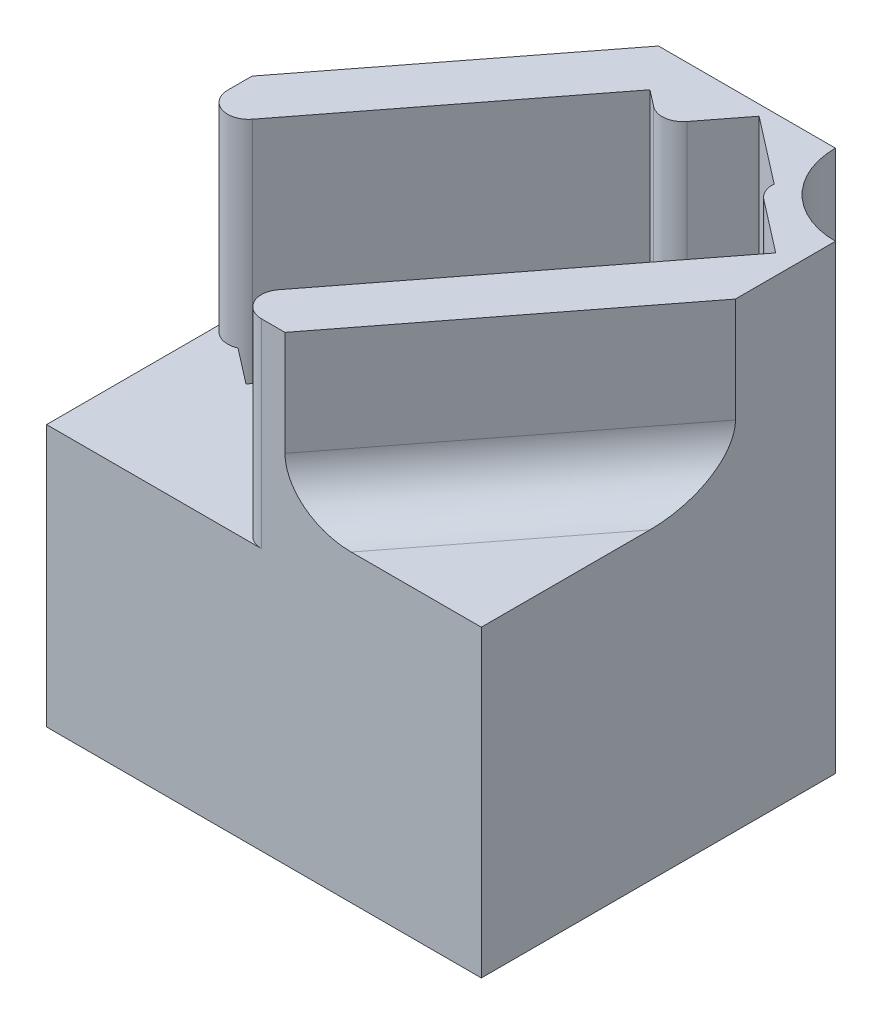
ISO-10303-21;
HEADER;
FILE_DESCRIPTION(('STEP AP214'),'2;1');
FILE_NAME('part.step','',(''),(''),'','','');
FILE_SCHEMA(('AUTOMOTIVE_DESIGN { 1 0 10303 214 1 1 1 1 }'));
ENDSEC;
DATA;
#1=APPLICATION_CONTEXT('core data for automotive mechanical design processes');
#2=APPLICATION_PROTOCOL_DEFINITION('international standard','automotive_design',2000,#1);
#3=PRODUCT_CONTEXT('',#1,'mechanical');
#4=PRODUCT('Part','Part','',(#3));
#5=PRODUCT_RELATED_PRODUCT_CATEGORY('part','',(#4));
#6=PRODUCT_DEFINITION_FORMATION('','',#4);
#7=PRODUCT_DEFINITION_CONTEXT('part definition',#1,'design');
#8=PRODUCT_DEFINITION('design','',#6,#7);
#9=PRODUCT_DEFINITION_SHAPE('','',#8);
#10=(LENGTH_UNIT() NAMED_UNIT(*) SI_UNIT(.MILLI.,.METRE.));
#11=(NAMED_UNIT(*) PLANE_ANGLE_UNIT() SI_UNIT($,.RADIAN.));
#12=(NAMED_UNIT(*) SI_UNIT($,.STERADIAN.) SOLID_ANGLE_UNIT());
#13=UNCERTAINTY_MEASURE_WITH_UNIT(LENGTH_MEASURE(1.E-05),#10,'distance_accuracy_value','');
#14=(GEOMETRIC_REPRESENTATION_CONTEXT(3) GLOBAL_UNCERTAINTY_ASSIGNED_CONTEXT((#13)) GLOBAL_UNIT_ASSIGNED_CONTEXT((#10,
#11,#12)) REPRESENTATION_CONTEXT('',''));
#15=CARTESIAN_POINT('',(0.,0.,0.));
#16=DIRECTION('',(0.,0.,1.));
#17=DIRECTION('',(1.,0.,0.));
#18=AXIS2_PLACEMENT_3D('',#15,#16,#17);
#19=CARTESIAN_POINT('',(6.16520869063758,22.,-12.8703707176091));
#20=DIRECTION('',(-0.61142527879089,0.,0.791302172659398));
#21=DIRECTION('',(0.791302172659398,0.,0.61142527879089));
#22=AXIS2_PLACEMENT_3D('',#19,#20,#21);
#23=PLANE('',#22);
#24=DIRECTION('',(0.791302172659398,0.,0.61142527879089));
#25=VECTOR('',#24,1.);
#26=CARTESIAN_POINT('',(2.99999999999999,25.,-15.3160718327727));
#27=LINE('',#26,#25);
#28=CARTESIAN_POINT('',(2.80883986901435,25.,-15.4637779056485));
#29=VERTEX_POINT('',#28);
#30=CARTESIAN_POINT('',(6.16520869063759,25.,-12.8703707176091));
#31=VERTEX_POINT('',#30);
#32=EDGE_CURVE('E363',#29,#31,#27,.T.);
#33=ORIENTED_EDGE('',*,*,#32,.T.);
#34=DIRECTION('',(0.,1.,0.));
#35=VECTOR('',#34,1.);
#36=CARTESIAN_POINT('',(6.16520869063758,22.,-12.8703707176091));
#37=LINE('',#36,#35);
#38=CARTESIAN_POINT('',(6.16520869063758,22.,-12.8703707176091));
#39=VERTEX_POINT('',#38);
#40=EDGE_CURVE('E403',#39,#31,#37,.T.);
#41=ORIENTED_EDGE('',*,*,#40,.F.);
#42=DIRECTION('',(0.791302172659398,0.,0.61142527879089));
#43=VECTOR('',#42,1.);
#44=CARTESIAN_POINT('',(6.16520869063758,22.,-12.8703707176091));
#45=LINE('',#44,#43);
#46=CARTESIAN_POINT('',(2.80883986901435,22.,-15.4637779056485));
#47=VERTEX_POINT('',#46);
#48=EDGE_CURVE('E386',#47,#39,#45,.T.);
#49=ORIENTED_EDGE('',*,*,#48,.F.);
#50=DIRECTION('',(0.,1.,0.));
#51=VECTOR('',#50,1.);
#52=CARTESIAN_POINT('',(2.80883986901435,22.,-15.4637779056485));
#53=LINE('',#52,#51);
#54=EDGE_CURVE('E297',#47,#29,#53,.T.);
#55=ORIENTED_EDGE('',*,*,#54,.T.);
#56=EDGE_LOOP('',(#33,#41,#49,#55));
#57=FACE_BOUND('',#56,.T.);
#58=ADVANCED_FACE('F41',(#57),#23,.F.);
#59=CARTESIAN_POINT('',(0.,44.,-41.5));
#60=DIRECTION('',(1.,0.,0.));
#61=DIRECTION('',(0.,0.,-1.));
#62=AXIS2_PLACEMENT_3D('',#59,#60,#61);
#63=PLANE('',#62);
#64=DIRECTION('',(0.,0.,1.));
#65=VECTOR('',#64,1.);
#66=CARTESIAN_POINT('',(0.,25.,0.));
#67=LINE('',#66,#65);
#68=CARTESIAN_POINT('',(0.,25.,-17.2929247194097));
#69=VERTEX_POINT('',#68);
#70=CARTESIAN_POINT('',(0.,25.,0.));
#71=VERTEX_POINT('',#70);
#72=EDGE_CURVE('E431',#69,#71,#67,.T.);
#73=ORIENTED_EDGE('',*,*,#72,.F.);
#74=DIRECTION('',(0.,1.,0.));
#75=VECTOR('',#74,1.);
#76=CARTESIAN_POINT('',(0.,44.,-17.2929247194097));
#77=LINE('',#76,#75);
#78=CARTESIAN_POINT('',(0.,44.,-17.2929247194097));
#79=VERTEX_POINT('',#78);
#80=EDGE_CURVE('E277',#69,#79,#77,.T.);
#81=ORIENTED_EDGE('',*,*,#80,.T.);
#82=DIRECTION('',(0.,0.,1.));
#83=VECTOR('',#82,1.);
#84=CARTESIAN_POINT('',(0.,44.,-41.5));
#85=LINE('',#84,#83);
#86=CARTESIAN_POINT('',(0.,44.,-19.611107666448));
#87=VERTEX_POINT('',#86);
#88=EDGE_CURVE('E451',#87,#79,#85,.T.);
#89=ORIENTED_EDGE('',*,*,#88,.F.);
#90=DIRECTION('',(0.,1.,0.));
#91=VECTOR('',#90,1.);
#92=CARTESIAN_POINT('',(0.,29.,-19.611107666448));
#93=LINE('',#92,#91);
#94=CARTESIAN_POINT('',(0.,34.,-19.611107666448));
#95=VERTEX_POINT('',#94);
#96=EDGE_CURVE('E331',#95,#87,#93,.T.);
#97=ORIENTED_EDGE('',*,*,#96,.F.);
#98=CARTESIAN_POINT('',(0.,34.,-27.7887217976263));
#99=DIRECTION('',(1.,0.,0.));
#100=DIRECTION('',(0.,0.,1.));
#101=AXIS2_PLACEMENT_3D('',#98,#99,#100);
#102=ELLIPSE('',#101,8.17761413117827,5.);
#103=CARTESIAN_POINT('',(0.,29.,-27.7887217976263));
#104=VERTEX_POINT('',#103);
#105=EDGE_CURVE('E319',#95,#104,#102,.T.);
#106=ORIENTED_EDGE('',*,*,#105,.T.);
#107=DIRECTION('',(0.,0.,1.));
#108=VECTOR('',#107,1.);
#109=CARTESIAN_POINT('',(0.,29.,-41.5));
#110=LINE('',#109,#108);
#111=CARTESIAN_POINT('',(0.,29.,-41.5));
#112=VERTEX_POINT('',#111);
#113=EDGE_CURVE('E328',#112,#104,#110,.T.);
#114=ORIENTED_EDGE('',*,*,#113,.F.);
#115=DIRECTION('',(0.,-1.,0.));
#116=VECTOR('',#115,1.);
#117=CARTESIAN_POINT('',(0.,44.,-41.5));
#118=LINE('',#117,#116);
#119=CARTESIAN_POINT('',(0.,0.,-41.5));
#120=VERTEX_POINT('',#119);
#121=EDGE_CURVE('E469',#112,#120,#118,.T.);
#122=ORIENTED_EDGE('',*,*,#121,.T.);
#123=DIRECTION('',(0.,0.,1.));
#124=VECTOR('',#123,1.);
#125=CARTESIAN_POINT('',(0.,0.,-41.5));
#126=LINE('',#125,#124);
#127=CARTESIAN_POINT('',(0.,0.,0.));
#128=VERTEX_POINT('',#127);
#129=EDGE_CURVE('E447',#120,#128,#126,.T.);
#130=ORIENTED_EDGE('',*,*,#129,.T.);
#131=DIRECTION('',(0.,-1.,0.));
#132=VECTOR('',#131,1.);
#133=CARTESIAN_POINT('',(0.,44.,0.));
#134=LINE('',#133,#132);
#135=EDGE_CURVE('E232',#71,#128,#134,.T.);
#136=ORIENTED_EDGE('',*,*,#135,.F.);
#137=EDGE_LOOP('',(#73,#81,#89,#97,#106,#114,#122,#130,#136));
#138=FACE_BOUND('',#137,.T.);
#139=ADVANCED_FACE('F327',(#138),#63,.F.);
#140=CARTESIAN_POINT('',(41.5,44.,0.));
#141=DIRECTION('',(0.,0.,-1.));
#142=DIRECTION('',(-1.,0.,0.));
#143=AXIS2_PLACEMENT_3D('',#140,#141,#142);
#144=PLANE('',#143);
#145=DIRECTION('',(1.,0.,0.));
#146=VECTOR('',#145,1.);
#147=CARTESIAN_POINT('',(41.5,44.,0.));
#148=LINE('',#147,#146);
#149=CARTESIAN_POINT('',(20.5131795994859,44.,0.));
#150=VERTEX_POINT('',#149);
#151=CARTESIAN_POINT('',(22.7590339694362,44.,0.));
#152=VERTEX_POINT('',#151);
#153=EDGE_CURVE('E455',#150,#152,#148,.T.);
#154=ORIENTED_EDGE('',*,*,#153,.F.);
#155=DIRECTION('',(0.,1.,0.));
#156=VECTOR('',#155,1.);
#157=CARTESIAN_POINT('',(20.5131795994859,44.,0.));
#158=LINE('',#157,#156);
#159=CARTESIAN_POINT('',(20.5131795994859,25.,0.));
#160=VERTEX_POINT('',#159);
#161=EDGE_CURVE('E273',#150,#160,#158,.F.);
#162=ORIENTED_EDGE('',*,*,#161,.T.);
#163=DIRECTION('',(1.,0.,0.));
#164=VECTOR('',#163,1.);
#165=CARTESIAN_POINT('',(6.33041738127518,25.,0.));
#166=LINE('',#165,#164);
#167=EDGE_CURVE('E434',#71,#160,#166,.T.);
#168=ORIENTED_EDGE('',*,*,#167,.F.);
#169=ORIENTED_EDGE('',*,*,#135,.T.);
#170=DIRECTION('',(1.,0.,0.));
#171=VECTOR('',#170,1.);
#172=CARTESIAN_POINT('',(41.5,0.,0.));
#173=LINE('',#172,#171);
#174=CARTESIAN_POINT('',(41.5,0.,0.));
#175=VERTEX_POINT('',#174);
#176=EDGE_CURVE('E229',#128,#175,#173,.T.);
#177=ORIENTED_EDGE('',*,*,#176,.T.);
#178=DIRECTION('',(0.,-1.,0.));
#179=VECTOR('',#178,1.);
#180=CARTESIAN_POINT('',(41.5,44.,0.));
#181=LINE('',#180,#179);
#182=CARTESIAN_POINT('',(41.5,29.,0.));
#183=VERTEX_POINT('',#182);
#184=EDGE_CURVE('E220',#183,#175,#181,.T.);
#185=ORIENTED_EDGE('',*,*,#184,.F.);
#186=DIRECTION('',(1.,0.,0.));
#187=VECTOR('',#186,1.);
#188=CARTESIAN_POINT('',(41.5,29.,0.));
#189=LINE('',#188,#187);
#190=CARTESIAN_POINT('',(29.0777326571904,29.,0.));
#191=VERTEX_POINT('',#190);
#192=EDGE_CURVE('E207',#191,#183,#189,.T.);
#193=ORIENTED_EDGE('',*,*,#192,.F.);
#194=CARTESIAN_POINT('',(29.0777326571904,34.,0.));
#195=DIRECTION('',(0.,0.,-1.));
#196=DIRECTION('',(-1.,0.,0.));
#197=AXIS2_PLACEMENT_3D('',#194,#195,#196);
#198=ELLIPSE('',#197,6.31869868775423,5.);
#199=CARTESIAN_POINT('',(22.7590339694362,34.,0.));
#200=VERTEX_POINT('',#199);
#201=EDGE_CURVE('E50',#191,#200,#198,.T.);
#202=ORIENTED_EDGE('',*,*,#201,.T.);
#203=DIRECTION('',(0.,1.,0.));
#204=VECTOR('',#203,1.);
#205=CARTESIAN_POINT('',(22.7590339694362,29.,0.));
#206=LINE('',#205,#204);
#207=EDGE_CURVE('E367',#200,#152,#206,.T.);
#208=ORIENTED_EDGE('',*,*,#207,.T.);
#209=EDGE_LOOP('',(#154,#162,#168,#169,#177,#185,#193,#202,#208));
#210=FACE_BOUND('',#209,.T.);
#211=ADVANCED_FACE('F227',(#210),#144,.F.);
#212=CARTESIAN_POINT('',(41.5,44.,-33.8));
#213=DIRECTION('',(-1.,0.,0.));
#214=DIRECTION('',(0.,0.,1.));
#215=AXIS2_PLACEMENT_3D('',#212,#213,#214);
#216=PLANE('',#215);
#217=DIRECTION('',(0.,0.,-1.));
#218=VECTOR('',#217,1.);
#219=CARTESIAN_POINT('',(41.5,44.,-33.8));
#220=LINE('',#219,#218);
#221=CARTESIAN_POINT('',(41.5,44.,-24.2544226615023));
#222=VERTEX_POINT('',#221);
#223=CARTESIAN_POINT('',(41.5,44.,-33.8));
#224=VERTEX_POINT('',#223);
#225=EDGE_CURVE('E460',#222,#224,#220,.T.);
#226=ORIENTED_EDGE('',*,*,#225,.F.);
#227=DIRECTION('',(0.,1.,0.));
#228=VECTOR('',#227,1.);
#229=CARTESIAN_POINT('',(41.5,29.,-24.2544226615023));
#230=LINE('',#229,#228);
#231=CARTESIAN_POINT('',(41.5,34.,-24.2544226615023));
#232=VERTEX_POINT('',#231);
#233=EDGE_CURVE('E224',#232,#222,#230,.T.);
#234=ORIENTED_EDGE('',*,*,#233,.F.);
#235=CARTESIAN_POINT('',(41.5,34.,-16.076808530324));
#236=DIRECTION('',(-1.,0.,0.));
#237=DIRECTION('',(0.,0.,1.));
#238=AXIS2_PLACEMENT_3D('',#235,#236,#237);
#239=ELLIPSE('',#238,8.17761413117827,5.);
#240=CARTESIAN_POINT('',(41.5,29.,-16.076808530324));
#241=VERTEX_POINT('',#240);
#242=EDGE_CURVE('E11',#232,#241,#239,.T.);
#243=ORIENTED_EDGE('',*,*,#242,.T.);
#244=DIRECTION('',(0.,0.,-1.));
#245=VECTOR('',#244,1.);
#246=CARTESIAN_POINT('',(41.5,29.,-24.2544226615023));
#247=LINE('',#246,#245);
#248=EDGE_CURVE('E210',#183,#241,#247,.T.);
#249=ORIENTED_EDGE('',*,*,#248,.F.);
#250=ORIENTED_EDGE('',*,*,#184,.T.);
#251=DIRECTION('',(0.,0.,-1.));
#252=VECTOR('',#251,1.);
#253=CARTESIAN_POINT('',(41.5,0.,-33.8));
#254=LINE('',#253,#252);
#255=CARTESIAN_POINT('',(41.5,0.,-33.8));
#256=VERTEX_POINT('',#255);
#257=EDGE_CURVE('E475',#175,#256,#254,.T.);
#258=ORIENTED_EDGE('',*,*,#257,.T.);
#259=DIRECTION('',(0.,-1.,0.));
#260=VECTOR('',#259,1.);
#261=CARTESIAN_POINT('',(41.5,44.,-33.8));
#262=LINE('',#261,#260);
#263=EDGE_CURVE('E233',#224,#256,#262,.T.);
#264=ORIENTED_EDGE('',*,*,#263,.F.);
#265=EDGE_LOOP('',(#226,#234,#243,#249,#250,#258,#264));
#266=FACE_BOUND('',#265,.T.);
#267=ADVANCED_FACE('F219',(#266),#216,.F.);
#268=CARTESIAN_POINT('',(41.5,44.,-41.5));
#269=DIRECTION('',(0.,-1.,0.));
#270=DIRECTION('',(0.,0.,-1.));
#271=AXIS2_PLACEMENT_3D('',#268,#269,#270);
#272=CYLINDRICAL_SURFACE('',#271,7.7);
#273=CARTESIAN_POINT('',(41.5,0.,-41.5));
#274=DIRECTION('',(0.,-1.,0.));
#275=DIRECTION('',(0.,0.,1.));
#276=AXIS2_PLACEMENT_3D('',#273,#274,#275);
#277=CIRCLE('',#276,7.7);
#278=CARTESIAN_POINT('',(33.8,0.,-41.5));
#279=VERTEX_POINT('',#278);
#280=EDGE_CURVE('E478',#256,#279,#277,.T.);
#281=ORIENTED_EDGE('',*,*,#280,.T.);
#282=DIRECTION('',(0.,-1.,0.));
#283=VECTOR('',#282,1.);
#284=CARTESIAN_POINT('',(33.8,44.,-41.5));
#285=LINE('',#284,#283);
#286=CARTESIAN_POINT('',(33.8,44.,-41.5));
#287=VERTEX_POINT('',#286);
#288=EDGE_CURVE('E240',#287,#279,#285,.T.);
#289=ORIENTED_EDGE('',*,*,#288,.F.);
#290=CARTESIAN_POINT('',(41.5,44.,-41.5));
#291=DIRECTION('',(0.,-1.,0.));
#292=DIRECTION('',(0.,0.,1.));
#293=AXIS2_PLACEMENT_3D('',#290,#291,#292);
#294=CIRCLE('',#293,7.7);
#295=EDGE_CURVE('E463',#224,#287,#294,.T.);
#296=ORIENTED_EDGE('',*,*,#295,.F.);
#297=ORIENTED_EDGE('',*,*,#263,.T.);
#298=EDGE_LOOP('',(#281,#289,#296,#297));
#299=FACE_BOUND('',#298,.T.);
#300=ADVANCED_FACE('F557',(#299),#272,.F.);
#301=CARTESIAN_POINT('',(33.8,44.,-41.5));
#302=DIRECTION('',(0.,0.,1.));
#303=DIRECTION('',(1.,0.,0.));
#304=AXIS2_PLACEMENT_3D('',#301,#302,#303);
#305=PLANE('',#304);
#306=DIRECTION('',(-1.,0.,0.));
#307=VECTOR('',#306,1.);
#308=CARTESIAN_POINT('',(16.9131623289836,29.,-41.5));
#309=LINE('',#308,#307);
#310=CARTESIAN_POINT('',(10.5944636412294,29.,-41.5));
#311=VERTEX_POINT('',#310);
#312=EDGE_CURVE('E338',#311,#112,#309,.T.);
#313=ORIENTED_EDGE('',*,*,#312,.F.);
#314=CARTESIAN_POINT('',(10.5944636412294,34.,-41.5));
#315=DIRECTION('',(0.,0.,1.));
#316=DIRECTION('',(-1.,0.,0.));
#317=AXIS2_PLACEMENT_3D('',#314,#315,#316);
#318=ELLIPSE('',#317,6.31869868775422,5.);
#319=CARTESIAN_POINT('',(16.9131623289836,34.,-41.5));
#320=VERTEX_POINT('',#319);
#321=EDGE_CURVE('E316',#311,#320,#318,.T.);
#322=ORIENTED_EDGE('',*,*,#321,.T.);
#323=DIRECTION('',(0.,1.,0.));
#324=VECTOR('',#323,1.);
#325=CARTESIAN_POINT('',(16.9131623289836,29.,-41.5));
#326=LINE('',#325,#324);
#327=CARTESIAN_POINT('',(16.9131623289836,44.,-41.5));
#328=VERTEX_POINT('',#327);
#329=EDGE_CURVE('E347',#320,#328,#326,.T.);
#330=ORIENTED_EDGE('',*,*,#329,.T.);
#331=DIRECTION('',(-1.,0.,0.));
#332=VECTOR('',#331,1.);
#333=CARTESIAN_POINT('',(33.8,44.,-41.5));
#334=LINE('',#333,#332);
#335=EDGE_CURVE('E466',#287,#328,#334,.T.);
#336=ORIENTED_EDGE('',*,*,#335,.F.);
#337=ORIENTED_EDGE('',*,*,#288,.T.);
#338=DIRECTION('',(-1.,0.,0.));
#339=VECTOR('',#338,1.);
#340=CARTESIAN_POINT('',(33.8,0.,-41.5));
#341=LINE('',#340,#339);
#342=EDGE_CURVE('E456',#279,#120,#341,.T.);
#343=ORIENTED_EDGE('',*,*,#342,.T.);
#344=ORIENTED_EDGE('',*,*,#121,.F.);
#345=EDGE_LOOP('',(#313,#322,#330,#336,#337,#343,#344));
#346=FACE_BOUND('',#345,.T.);
#347=ADVANCED_FACE('F345',(#346),#305,.F.);
#348=CARTESIAN_POINT('',(41.5,44.,-41.5));
#349=DIRECTION('',(0.,1.,0.));
#350=DIRECTION('',(0.,0.,1.));
#351=AXIS2_PLACEMENT_3D('',#348,#349,#350);
#352=PLANE('',#351);
#353=DIRECTION('',(-0.791302172659396,0.,-0.611425278790892));
#354=VECTOR('',#353,1.);
#355=CARTESIAN_POINT('',(27.51413754559,44.,-40.5));
#356=LINE('',#355,#354);
#357=CARTESIAN_POINT('',(33.8445549268652,44.,-35.6085977696729));
#358=VERTEX_POINT('',#357);
#359=CARTESIAN_POINT('',(27.51413754559,44.,-40.5));
#360=VERTEX_POINT('',#359);
#361=EDGE_CURVE('E413',#358,#360,#356,.T.);
#362=ORIENTED_EDGE('',*,*,#361,.F.);
#363=CARTESIAN_POINT('',(35.8366100366417,44.,-35.4305066704752));
#364=DIRECTION('',(0.,1.,0.));
#365=DIRECTION('',(0.,0.,1.));
#366=AXIS2_PLACEMENT_3D('',#363,#364,#365);
#367=CIRCLE('',#366,2.);
#368=CARTESIAN_POINT('',(34.6137594790599,44.,-33.8479023251564));
#369=VERTEX_POINT('',#368);
#370=EDGE_CURVE('E252',#358,#369,#367,.T.);
#371=ORIENTED_EDGE('',*,*,#370,.T.);
#372=DIRECTION('',(-0.791302172659397,0.,-0.61142527879089));
#373=VECTOR('',#372,1.);
#374=CARTESIAN_POINT('',(33.2802515689055,44.,-34.8782804460654));
#375=LINE('',#374,#373);
#376=CARTESIAN_POINT('',(39.6106689501807,44.,-29.9868782157383));
#377=VERTEX_POINT('',#376);
#378=EDGE_CURVE('E372',#377,#369,#375,.T.);
#379=ORIENTED_EDGE('',*,*,#378,.F.);
#380=DIRECTION('',(0.611425278790889,0.,-0.791302172659398));
#381=VECTOR('',#380,1.);
#382=CARTESIAN_POINT('',(17.5993589137087,44.,-1.5));
#383=LINE('',#382,#381);
#384=CARTESIAN_POINT('',(18.9305752541671,44.,-3.22285055758178));
#385=VERTEX_POINT('',#384);
#386=EDGE_CURVE('E366',#385,#377,#383,.T.);
#387=ORIENTED_EDGE('',*,*,#386,.F.);
#388=CARTESIAN_POINT('',(20.5131795994859,44.,-2.));
#389=DIRECTION('',(0.,1.,0.));
#390=DIRECTION('',(0.,0.,1.));
#391=AXIS2_PLACEMENT_3D('',#388,#389,#390);
#392=CIRCLE('',#391,2.);
#393=EDGE_CURVE('E246',#385,#150,#392,.T.);
#394=ORIENTED_EDGE('',*,*,#393,.T.);
#395=ORIENTED_EDGE('',*,*,#153,.T.);
#396=DIRECTION('',(-0.61142527879089,0.,0.791302172659397));
#397=VECTOR('',#396,1.);
#398=CARTESIAN_POINT('',(22.7590339694362,44.,0.));
#399=LINE('',#398,#397);
#400=EDGE_CURVE('E215',#222,#152,#399,.T.);
#401=ORIENTED_EDGE('',*,*,#400,.F.);
#402=ORIENTED_EDGE('',*,*,#225,.T.);
#403=ORIENTED_EDGE('',*,*,#295,.T.);
#404=ORIENTED_EDGE('',*,*,#335,.T.);
#405=DIRECTION('',(0.61142527879089,0.,-0.791302172659397));
#406=VECTOR('',#405,1.);
#407=CARTESIAN_POINT('',(0.,44.,-19.611107666448));
#408=LINE('',#407,#406);
#409=EDGE_CURVE('E340',#87,#328,#408,.T.);
#410=ORIENTED_EDGE('',*,*,#409,.F.);
#411=ORIENTED_EDGE('',*,*,#88,.T.);
#412=CARTESIAN_POINT('',(2.,44.,-17.2929247194097));
#413=DIRECTION('',(0.,1.,0.));
#414=DIRECTION('',(0.,0.,1.));
#415=AXIS2_PLACEMENT_3D('',#412,#413,#414);
#416=CIRCLE('',#415,2.);
#417=CARTESIAN_POINT('',(3.5826043453188,44.,-16.0700741618279));
#418=VERTEX_POINT('',#417);
#419=EDGE_CURVE('E237',#79,#418,#416,.T.);
#420=ORIENTED_EDGE('',*,*,#419,.T.);
#421=DIRECTION('',(-0.61142527879089,0.,0.791302172659397));
#422=VECTOR('',#421,1.);
#423=CARTESIAN_POINT('',(2.99999999999999,44.,-15.3160718327727));
#424=LINE('',#423,#422);
#425=CARTESIAN_POINT('',(20.1199078061449,44.,-37.4725326672358));
#426=VERTEX_POINT('',#425);
#427=EDGE_CURVE('E391',#426,#418,#424,.T.);
#428=ORIENTED_EDGE('',*,*,#427,.F.);
#429=DIRECTION('',(-0.791302172659397,0.,-0.611425278790891));
#430=VECTOR('',#429,1.);
#431=CARTESIAN_POINT('',(23.2851164967825,44.,-35.0268315520722));
#432=LINE('',#431,#430);
#433=CARTESIAN_POINT('',(21.7025121514637,44.,-36.249682109654));
#434=VERTEX_POINT('',#433);
#435=EDGE_CURVE('E385',#434,#426,#432,.T.);
#436=ORIENTED_EDGE('',*,*,#435,.F.);
#437=CARTESIAN_POINT('',(22.9253627090455,44.,-37.8322864549728));
#438=DIRECTION('',(0.,1.,0.));
#439=DIRECTION('',(0.,0.,1.));
#440=AXIS2_PLACEMENT_3D('',#437,#438,#439);
#441=CIRCLE('',#440,2.);
#442=CARTESIAN_POINT('',(24.5079670543643,44.,-36.609435897391));
#443=VERTEX_POINT('',#442);
#444=EDGE_CURVE('E249',#434,#443,#441,.T.);
#445=ORIENTED_EDGE('',*,*,#444,.T.);
#446=DIRECTION('',(-0.61142527879089,0.,0.791302172659397));
#447=VECTOR('',#446,1.);
#448=CARTESIAN_POINT('',(0.,44.,-4.89140223032711));
#449=LINE('',#448,#447);
#450=EDGE_CURVE('E426',#360,#443,#449,.T.);
#451=ORIENTED_EDGE('',*,*,#450,.F.);
#452=EDGE_LOOP('',(#362,#371,#379,#387,#394,#395,#401,#402,#403,#404,#410,#411,#420,#428,#436,
#445,#451));
#453=FACE_BOUND('',#452,.T.);
#454=ADVANCED_FACE('F512',(#453),#352,.T.);
#455=CARTESIAN_POINT('',(41.5,0.,-41.5));
#456=DIRECTION('',(0.,1.,0.));
#457=DIRECTION('',(0.,0.,1.));
#458=AXIS2_PLACEMENT_3D('',#455,#456,#457);
#459=PLANE('',#458);
#460=ORIENTED_EDGE('',*,*,#129,.F.);
#461=ORIENTED_EDGE('',*,*,#342,.F.);
#462=ORIENTED_EDGE('',*,*,#280,.F.);
#463=ORIENTED_EDGE('',*,*,#257,.F.);
#464=ORIENTED_EDGE('',*,*,#176,.F.);
#465=EDGE_LOOP('',(#460,#461,#462,#463,#464));
#466=FACE_BOUND('',#465,.T.);
#467=ADVANCED_FACE('F494',(#466),#459,.F.);
#468=CARTESIAN_POINT('',(0.,25.,-4.89140223032711));
#469=DIRECTION('',(-0.791302172659397,0.,-0.61142527879089));
#470=DIRECTION('',(-0.61142527879089,0.,0.791302172659397));
#471=AXIS2_PLACEMENT_3D('',#468,#469,#470);
#472=PLANE('',#471);
#473=ORIENTED_EDGE('',*,*,#450,.T.);
#474=DIRECTION('',(0.,1.,0.));
#475=VECTOR('',#474,1.);
#476=CARTESIAN_POINT('',(24.5079670543643,25.,-36.609435897391));
#477=LINE('',#476,#475);
#478=CARTESIAN_POINT('',(24.5079670543643,25.,-36.609435897391));
#479=VERTEX_POINT('',#478);
#480=EDGE_CURVE('E266',#443,#479,#477,.F.);
#481=ORIENTED_EDGE('',*,*,#480,.T.);
#482=DIRECTION('',(-0.61142527879089,0.,0.791302172659397));
#483=VECTOR('',#482,1.);
#484=CARTESIAN_POINT('',(0.,25.,-4.89140223032711));
#485=LINE('',#484,#483);
#486=CARTESIAN_POINT('',(27.51413754559,25.,-40.5));
#487=VERTEX_POINT('',#486);
#488=EDGE_CURVE('E427',#487,#479,#485,.T.);
#489=ORIENTED_EDGE('',*,*,#488,.F.);
#490=DIRECTION('',(0.,1.,0.));
#491=VECTOR('',#490,1.);
#492=CARTESIAN_POINT('',(27.51413754559,25.,-40.5));
#493=LINE('',#492,#491);
#494=EDGE_CURVE('E444',#487,#360,#493,.T.);
#495=ORIENTED_EDGE('',*,*,#494,.T.);
#496=EDGE_LOOP('',(#473,#481,#489,#495));
#497=FACE_BOUND('',#496,.T.);
#498=ADVANCED_FACE('F544',(#497),#472,.F.);
#499=CARTESIAN_POINT('',(27.51413754559,25.,-40.5));
#500=DIRECTION('',(0.611425278790892,0.,-0.791302172659396));
#501=DIRECTION('',(-0.791302172659396,0.,-0.611425278790892));
#502=AXIS2_PLACEMENT_3D('',#499,#500,#501);
#503=PLANE('',#502);
#504=ORIENTED_EDGE('',*,*,#361,.T.);
#505=ORIENTED_EDGE('',*,*,#494,.F.);
#506=DIRECTION('',(-0.791302172659396,0.,-0.611425278790892));
#507=VECTOR('',#506,1.);
#508=CARTESIAN_POINT('',(27.51413754559,25.,-40.5));
#509=LINE('',#508,#507);
#510=CARTESIAN_POINT('',(33.8445549268652,25.,-35.6085977696729));
#511=VERTEX_POINT('',#510);
#512=EDGE_CURVE('E421',#511,#487,#509,.T.);
#513=ORIENTED_EDGE('',*,*,#512,.F.);
#514=DIRECTION('',(0.,1.,0.));
#515=VECTOR('',#514,1.);
#516=CARTESIAN_POINT('',(33.8445549268652,25.,-35.6085977696729));
#517=LINE('',#516,#515);
#518=EDGE_CURVE('E437',#511,#358,#517,.T.);
#519=ORIENTED_EDGE('',*,*,#518,.T.);
#520=EDGE_LOOP('',(#504,#505,#513,#519));
#521=FACE_BOUND('',#520,.T.);
#522=ADVANCED_FACE('F543',(#521),#503,.F.);
#523=CARTESIAN_POINT('',(0.,25.,0.));
#524=DIRECTION('',(0.,1.,0.));
#525=DIRECTION('',(0.,0.,1.));
#526=AXIS2_PLACEMENT_3D('',#523,#524,#525);
#527=PLANE('',#526);
#528=CARTESIAN_POINT('',(23.2851164967825,25.,-35.0268315520722));
#529=VERTEX_POINT('',#528);
#530=EDGE_CURVE('E425',#529,#31,#485,.T.);
#531=ORIENTED_EDGE('',*,*,#530,.T.);
#532=ORIENTED_EDGE('',*,*,#32,.F.);
#533=CARTESIAN_POINT('',(2.,25.,-17.2929247194097));
#534=DIRECTION('',(0.,1.,0.));
#535=DIRECTION('',(0.,0.,1.));
#536=AXIS2_PLACEMENT_3D('',#533,#534,#535);
#537=CIRCLE('',#536,2.);
#538=EDGE_CURVE('E301',#29,#69,#537,.F.);
#539=ORIENTED_EDGE('',*,*,#538,.T.);
#540=ORIENTED_EDGE('',*,*,#72,.T.);
#541=ORIENTED_EDGE('',*,*,#167,.T.);
#542=CARTESIAN_POINT('',(20.5131795994859,25.,-2.));
#543=DIRECTION('',(0.,1.,0.));
#544=DIRECTION('',(0.,0.,1.));
#545=AXIS2_PLACEMENT_3D('',#542,#543,#544);
#546=CIRCLE('',#545,2.);
#547=CARTESIAN_POINT('',(18.9305752541671,25.,-3.22285055758178));
#548=VERTEX_POINT('',#547);
#549=EDGE_CURVE('E290',#160,#548,#546,.F.);
#550=ORIENTED_EDGE('',*,*,#549,.T.);
#551=DIRECTION('',(0.611425278790889,0.,-0.791302172659398));
#552=VECTOR('',#551,1.);
#553=CARTESIAN_POINT('',(17.5993589137087,25.,-1.5));
#554=LINE('',#553,#552);
#555=CARTESIAN_POINT('',(39.6106689501807,25.,-29.9868782157383));
#556=VERTEX_POINT('',#555);
#557=EDGE_CURVE('E368',#548,#556,#554,.T.);
#558=ORIENTED_EDGE('',*,*,#557,.T.);
#559=DIRECTION('',(-0.791302172659397,0.,-0.61142527879089));
#560=VECTOR('',#559,1.);
#561=CARTESIAN_POINT('',(33.2802515689055,25.,-34.8782804460654));
#562=LINE('',#561,#560);
#563=CARTESIAN_POINT('',(34.6137594790599,25.,-33.8479023251564));
#564=VERTEX_POINT('',#563);
#565=EDGE_CURVE('E371',#556,#564,#562,.T.);
#566=ORIENTED_EDGE('',*,*,#565,.T.);
#567=CARTESIAN_POINT('',(35.8366100366417,25.,-35.4305066704752));
#568=DIRECTION('',(0.,1.,0.));
#569=DIRECTION('',(0.,0.,1.));
#570=AXIS2_PLACEMENT_3D('',#567,#568,#569);
#571=CIRCLE('',#570,2.);
#572=EDGE_CURVE('E284',#564,#511,#571,.F.);
#573=ORIENTED_EDGE('',*,*,#572,.T.);
#574=ORIENTED_EDGE('',*,*,#512,.T.);
#575=ORIENTED_EDGE('',*,*,#488,.T.);
#576=CARTESIAN_POINT('',(22.9253627090455,25.,-37.8322864549728));
#577=DIRECTION('',(0.,1.,0.));
#578=DIRECTION('',(0.,0.,1.));
#579=AXIS2_PLACEMENT_3D('',#576,#577,#578);
#580=CIRCLE('',#579,2.);
#581=CARTESIAN_POINT('',(21.7025121514637,25.,-36.249682109654));
#582=VERTEX_POINT('',#581);
#583=EDGE_CURVE('E287',#479,#582,#580,.F.);
#584=ORIENTED_EDGE('',*,*,#583,.T.);
#585=DIRECTION('',(-0.791302172659397,0.,-0.611425278790891));
#586=VECTOR('',#585,1.);
#587=CARTESIAN_POINT('',(25.651685247839,25.,-33.1982254792119));
#588=LINE('',#587,#586);
#589=EDGE_CURVE('E258',#529,#582,#588,.T.);
#590=ORIENTED_EDGE('',*,*,#589,.F.);
#591=EDGE_LOOP('',(#531,#532,#539,#540,#541,#550,#558,#566,#573,#574,#575,#584,#590));
#592=FACE_BOUND('',#591,.T.);
#593=ADVANCED_FACE('F501',(#592),#527,.T.);
#594=CARTESIAN_POINT('',(2.99999999999999,22.,-15.3160718327727));
#595=DIRECTION('',(-0.791302172659397,0.,-0.61142527879089));
#596=DIRECTION('',(-0.61142527879089,0.,0.791302172659397));
#597=AXIS2_PLACEMENT_3D('',#594,#595,#596);
#598=PLANE('',#597);
#599=ORIENTED_EDGE('',*,*,#427,.T.);
#600=DIRECTION('',(0.,1.,0.));
#601=VECTOR('',#600,1.);
#602=CARTESIAN_POINT('',(3.5826043453188,22.,-16.0700741618279));
#603=LINE('',#602,#601);
#604=CARTESIAN_POINT('',(3.5826043453188,22.,-16.0700741618279));
#605=VERTEX_POINT('',#604);
#606=EDGE_CURVE('E281',#418,#605,#603,.F.);
#607=ORIENTED_EDGE('',*,*,#606,.T.);
#608=DIRECTION('',(-0.61142527879089,0.,0.791302172659397));
#609=VECTOR('',#608,1.);
#610=CARTESIAN_POINT('',(2.99999999999999,22.,-15.3160718327727));
#611=LINE('',#610,#609);
#612=CARTESIAN_POINT('',(20.1199078061449,22.,-37.4725326672358));
#613=VERTEX_POINT('',#612);
#614=EDGE_CURVE('E399',#613,#605,#611,.T.);
#615=ORIENTED_EDGE('',*,*,#614,.F.);
#616=DIRECTION('',(0.,1.,0.));
#617=VECTOR('',#616,1.);
#618=CARTESIAN_POINT('',(20.1199078061449,22.,-37.4725326672358));
#619=LINE('',#618,#617);
#620=EDGE_CURVE('E409',#613,#426,#619,.T.);
#621=ORIENTED_EDGE('',*,*,#620,.T.);
#622=EDGE_LOOP('',(#599,#607,#615,#621));
#623=FACE_BOUND('',#622,.T.);
#624=ADVANCED_FACE('F542',(#623),#598,.F.);
#625=CARTESIAN_POINT('',(23.2851164967825,22.,-35.0268315520722));
#626=DIRECTION('',(0.611425278790891,0.,-0.791302172659397));
#627=DIRECTION('',(-0.791302172659397,0.,-0.611425278790891));
#628=AXIS2_PLACEMENT_3D('',#625,#626,#627);
#629=PLANE('',#628);
#630=ORIENTED_EDGE('',*,*,#589,.T.);
#631=DIRECTION('',(0.,1.,0.));
#632=VECTOR('',#631,1.);
#633=CARTESIAN_POINT('',(21.7025121514637,22.,-36.249682109654));
#634=LINE('',#633,#632);
#635=EDGE_CURVE('E262',#582,#434,#634,.T.);
#636=ORIENTED_EDGE('',*,*,#635,.T.);
#637=ORIENTED_EDGE('',*,*,#435,.T.);
#638=ORIENTED_EDGE('',*,*,#620,.F.);
#639=DIRECTION('',(-0.791302172659397,0.,-0.611425278790891));
#640=VECTOR('',#639,1.);
#641=CARTESIAN_POINT('',(23.2851164967825,22.,-35.0268315520722));
#642=LINE('',#641,#640);
#643=CARTESIAN_POINT('',(23.2851164967825,22.,-35.0268315520722));
#644=VERTEX_POINT('',#643);
#645=EDGE_CURVE('E395',#644,#613,#642,.T.);
#646=ORIENTED_EDGE('',*,*,#645,.F.);
#647=DIRECTION('',(0.,1.,0.));
#648=VECTOR('',#647,1.);
#649=CARTESIAN_POINT('',(23.2851164967825,22.,-35.0268315520722));
#650=LINE('',#649,#648);
#651=EDGE_CURVE('E414',#644,#529,#650,.T.);
#652=ORIENTED_EDGE('',*,*,#651,.T.);
#653=EDGE_LOOP('',(#630,#636,#637,#638,#646,#652));
#654=FACE_BOUND('',#653,.T.);
#655=ADVANCED_FACE('F672',(#654),#629,.F.);
#656=CARTESIAN_POINT('',(6.16520869063758,22.,-12.8703707176091));
#657=DIRECTION('',(0.791302172659397,0.,0.61142527879089));
#658=DIRECTION('',(0.61142527879089,0.,-0.791302172659397));
#659=AXIS2_PLACEMENT_3D('',#656,#657,#658);
#660=PLANE('',#659);
#661=ORIENTED_EDGE('',*,*,#530,.F.);
#662=ORIENTED_EDGE('',*,*,#651,.F.);
#663=DIRECTION('',(0.61142527879089,0.,-0.791302172659397));
#664=VECTOR('',#663,1.);
#665=CARTESIAN_POINT('',(6.16520869063758,22.,-12.8703707176091));
#666=LINE('',#665,#664);
#667=EDGE_CURVE('E390',#39,#644,#666,.T.);
#668=ORIENTED_EDGE('',*,*,#667,.F.);
#669=ORIENTED_EDGE('',*,*,#40,.T.);
#670=EDGE_LOOP('',(#661,#662,#668,#669));
#671=FACE_BOUND('',#670,.T.);
#672=ADVANCED_FACE('F538',(#671),#660,.F.);
#673=CARTESIAN_POINT('',(0.,22.,0.));
#674=DIRECTION('',(0.,-1.,0.));
#675=DIRECTION('',(0.,0.,-1.));
#676=AXIS2_PLACEMENT_3D('',#673,#674,#675);
#677=PLANE('',#676);
#678=ORIENTED_EDGE('',*,*,#48,.T.);
#679=ORIENTED_EDGE('',*,*,#667,.T.);
#680=ORIENTED_EDGE('',*,*,#645,.T.);
#681=ORIENTED_EDGE('',*,*,#614,.T.);
#682=CARTESIAN_POINT('',(2.,22.,-17.2929247194097));
#683=DIRECTION('',(0.,-1.,0.));
#684=DIRECTION('',(0.,0.,-1.));
#685=AXIS2_PLACEMENT_3D('',#682,#683,#684);
#686=CIRCLE('',#685,2.);
#687=EDGE_CURVE('E293',#605,#47,#686,.T.);
#688=ORIENTED_EDGE('',*,*,#687,.T.);
#689=EDGE_LOOP('',(#678,#679,#680,#681,#688));
#690=FACE_BOUND('',#689,.T.);
#691=ADVANCED_FACE('F671',(#690),#677,.F.);
#692=CARTESIAN_POINT('',(33.2802515689055,25.,-34.8782804460654));
#693=DIRECTION('',(0.61142527879089,0.,-0.791302172659397));
#694=DIRECTION('',(-0.791302172659397,0.,-0.61142527879089));
#695=AXIS2_PLACEMENT_3D('',#692,#693,#694);
#696=PLANE('',#695);
#697=ORIENTED_EDGE('',*,*,#378,.T.);
#698=DIRECTION('',(0.,1.,0.));
#699=VECTOR('',#698,1.);
#700=CARTESIAN_POINT('',(34.6137594790599,25.,-33.8479023251564));
#701=LINE('',#700,#699);
#702=EDGE_CURVE('E255',#369,#564,#701,.F.);
#703=ORIENTED_EDGE('',*,*,#702,.T.);
#704=ORIENTED_EDGE('',*,*,#565,.F.);
#705=DIRECTION('',(0.,1.,0.));
#706=VECTOR('',#705,1.);
#707=CARTESIAN_POINT('',(39.6106689501807,25.,-29.9868782157383));
#708=LINE('',#707,#706);
#709=EDGE_CURVE('E376',#556,#377,#708,.T.);
#710=ORIENTED_EDGE('',*,*,#709,.T.);
#711=EDGE_LOOP('',(#697,#703,#704,#710));
#712=FACE_BOUND('',#711,.T.);
#713=ADVANCED_FACE('F729',(#712),#696,.F.);
#714=CARTESIAN_POINT('',(17.5993589137087,25.,-1.5));
#715=DIRECTION('',(0.791302172659398,0.,0.611425278790889));
#716=DIRECTION('',(0.611425278790889,0.,-0.791302172659398));
#717=AXIS2_PLACEMENT_3D('',#714,#715,#716);
#718=PLANE('',#717);
#719=ORIENTED_EDGE('',*,*,#557,.F.);
#720=DIRECTION('',(0.,1.,0.));
#721=VECTOR('',#720,1.);
#722=CARTESIAN_POINT('',(18.9305752541671,25.,-3.22285055758178));
#723=LINE('',#722,#721);
#724=EDGE_CURVE('E269',#548,#385,#723,.T.);
#725=ORIENTED_EDGE('',*,*,#724,.T.);
#726=ORIENTED_EDGE('',*,*,#386,.T.);
#727=ORIENTED_EDGE('',*,*,#709,.F.);
#728=EDGE_LOOP('',(#719,#725,#726,#727));
#729=FACE_BOUND('',#728,.T.);
#730=ADVANCED_FACE('F624',(#729),#718,.F.);
#731=CARTESIAN_POINT('',(0.,29.,-19.611107666448));
#732=DIRECTION('',(0.791302172659397,0.,0.61142527879089));
#733=DIRECTION('',(0.61142527879089,0.,-0.791302172659397));
#734=AXIS2_PLACEMENT_3D('',#731,#732,#733);
#735=PLANE('',#734);
#736=ORIENTED_EDGE('',*,*,#329,.F.);
#737=DIRECTION('',(0.61142527879089,0.,-0.791302172659397));
#738=VECTOR('',#737,1.);
#739=CARTESIAN_POINT('',(0.,34.,-19.611107666448));
#740=LINE('',#739,#738);
#741=EDGE_CURVE('E309',#320,#95,#740,.F.);
#742=ORIENTED_EDGE('',*,*,#741,.T.);
#743=ORIENTED_EDGE('',*,*,#96,.T.);
#744=ORIENTED_EDGE('',*,*,#409,.T.);
#745=EDGE_LOOP('',(#736,#742,#743,#744));
#746=FACE_BOUND('',#745,.T.);
#747=ADVANCED_FACE('F350',(#746),#735,.F.);
#748=CARTESIAN_POINT('',(0.,29.,0.));
#749=DIRECTION('',(0.,-1.,0.));
#750=DIRECTION('',(0.,0.,-1.));
#751=AXIS2_PLACEMENT_3D('',#748,#749,#750);
#752=PLANE('',#751);
#753=ORIENTED_EDGE('',*,*,#113,.T.);
#754=DIRECTION('',(0.61142527879089,0.,-0.791302172659397));
#755=VECTOR('',#754,1.);
#756=CARTESIAN_POINT('',(12.9566514656866,29.,-44.5571263939545));
#757=LINE('',#756,#755);
#758=EDGE_CURVE('E305',#104,#311,#757,.T.);
#759=ORIENTED_EDGE('',*,*,#758,.T.);
#760=ORIENTED_EDGE('',*,*,#312,.T.);
#761=EDGE_LOOP('',(#753,#759,#760));
#762=FACE_BOUND('',#761,.T.);
#763=ADVANCED_FACE('F336',(#762),#752,.F.);
#764=CARTESIAN_POINT('',(22.7590339694362,29.,0.));
#765=DIRECTION('',(-0.791302172659397,0.,-0.61142527879089));
#766=DIRECTION('',(-0.61142527879089,0.,0.791302172659397));
#767=AXIS2_PLACEMENT_3D('',#764,#765,#766);
#768=PLANE('',#767);
#769=ORIENTED_EDGE('',*,*,#207,.F.);
#770=DIRECTION('',(-0.61142527879089,0.,0.791302172659397));
#771=VECTOR('',#770,1.);
#772=CARTESIAN_POINT('',(22.7590339694362,34.,0.));
#773=LINE('',#772,#771);
#774=EDGE_CURVE('E57',#200,#232,#773,.F.);
#775=ORIENTED_EDGE('',*,*,#774,.T.);
#776=ORIENTED_EDGE('',*,*,#233,.T.);
#777=ORIENTED_EDGE('',*,*,#400,.T.);
#778=EDGE_LOOP('',(#769,#775,#776,#777));
#779=FACE_BOUND('',#778,.T.);
#780=ADVANCED_FACE('F522',(#779),#768,.F.);
#781=CARTESIAN_POINT('',(0.,29.,0.));
#782=DIRECTION('',(0.,1.,0.));
#783=DIRECTION('',(0.,0.,1.));
#784=AXIS2_PLACEMENT_3D('',#781,#782,#783);
#785=PLANE('',#784);
#786=ORIENTED_EDGE('',*,*,#248,.T.);
#787=DIRECTION('',(-0.61142527879089,0.,0.791302172659397));
#788=VECTOR('',#787,1.);
#789=CARTESIAN_POINT('',(18.2072877380878,29.,14.0684511757029));
#790=LINE('',#789,#788);
#791=EDGE_CURVE('E212',#241,#191,#790,.T.);
#792=ORIENTED_EDGE('',*,*,#791,.T.);
#793=ORIENTED_EDGE('',*,*,#192,.T.);
#794=EDGE_LOOP('',(#786,#792,#793));
#795=FACE_BOUND('',#794,.T.);
#796=ADVANCED_FACE('F209',(#795),#785,.T.);
#797=CARTESIAN_POINT('',(35.8366100366417,25.,-35.4305066704752));
#798=DIRECTION('',(0.,1.,0.));
#799=DIRECTION('',(0.,0.,1.));
#800=AXIS2_PLACEMENT_3D('',#797,#798,#799);
#801=CYLINDRICAL_SURFACE('',#800,2.);
#802=ORIENTED_EDGE('',*,*,#572,.F.);
#803=ORIENTED_EDGE('',*,*,#702,.F.);
#804=ORIENTED_EDGE('',*,*,#370,.F.);
#805=ORIENTED_EDGE('',*,*,#518,.F.);
#806=EDGE_LOOP('',(#802,#803,#804,#805));
#807=FACE_BOUND('',#806,.T.);
#808=ADVANCED_FACE('F564',(#807),#801,.T.);
#809=CARTESIAN_POINT('',(22.9253627090455,22.,-37.8322864549728));
#810=DIRECTION('',(0.,1.,0.));
#811=DIRECTION('',(0.,0.,1.));
#812=AXIS2_PLACEMENT_3D('',#809,#810,#811);
#813=CYLINDRICAL_SURFACE('',#812,2.);
#814=ORIENTED_EDGE('',*,*,#583,.F.);
#815=ORIENTED_EDGE('',*,*,#480,.F.);
#816=ORIENTED_EDGE('',*,*,#444,.F.);
#817=ORIENTED_EDGE('',*,*,#635,.F.);
#818=EDGE_LOOP('',(#814,#815,#816,#817));
#819=FACE_BOUND('',#818,.T.);
#820=ADVANCED_FACE('F567',(#819),#813,.T.);
#821=CARTESIAN_POINT('',(20.5131795994859,25.,-2.));
#822=DIRECTION('',(0.,1.,0.));
#823=DIRECTION('',(0.,0.,1.));
#824=AXIS2_PLACEMENT_3D('',#821,#822,#823);
#825=CYLINDRICAL_SURFACE('',#824,2.);
#826=ORIENTED_EDGE('',*,*,#549,.F.);
#827=ORIENTED_EDGE('',*,*,#161,.F.);
#828=ORIENTED_EDGE('',*,*,#393,.F.);
#829=ORIENTED_EDGE('',*,*,#724,.F.);
#830=EDGE_LOOP('',(#826,#827,#828,#829));
#831=FACE_BOUND('',#830,.T.);
#832=ADVANCED_FACE('F571',(#831),#825,.T.);
#833=CARTESIAN_POINT('',(2.,44.,-17.2929247194097));
#834=DIRECTION('',(0.,1.,0.));
#835=DIRECTION('',(0.,0.,1.));
#836=AXIS2_PLACEMENT_3D('',#833,#834,#835);
#837=CYLINDRICAL_SURFACE('',#836,2.);
#838=ORIENTED_EDGE('',*,*,#687,.F.);
#839=ORIENTED_EDGE('',*,*,#606,.F.);
#840=ORIENTED_EDGE('',*,*,#419,.F.);
#841=ORIENTED_EDGE('',*,*,#80,.F.);
#842=ORIENTED_EDGE('',*,*,#538,.F.);
#843=ORIENTED_EDGE('',*,*,#54,.F.);
#844=EDGE_LOOP('',(#838,#839,#840,#841,#842,#843));
#845=FACE_BOUND('',#844,.T.);
#846=ADVANCED_FACE('F508',(#845),#837,.T.);
#847=CARTESIAN_POINT('',(-13.444799168288,34.,-10.3885599759328));
#848=DIRECTION('',(-0.61142527879089,0.,0.791302172659397));
#849=DIRECTION('',(0.791302172659397,0.,0.61142527879089));
#850=AXIS2_PLACEMENT_3D('',#847,#848,#849);
#851=CYLINDRICAL_SURFACE('',#850,5.);
#852=ORIENTED_EDGE('',*,*,#105,.F.);
#853=ORIENTED_EDGE('',*,*,#741,.F.);
#854=ORIENTED_EDGE('',*,*,#321,.F.);
#855=ORIENTED_EDGE('',*,*,#758,.F.);
#856=EDGE_LOOP('',(#852,#853,#854,#855));
#857=FACE_BOUND('',#856,.T.);
#858=ADVANCED_FACE('F342',(#857),#851,.F.);
#859=CARTESIAN_POINT('',(18.2072877380878,34.,14.0684511757029));
#860=DIRECTION('',(-0.61142527879089,0.,0.791302172659397));
#861=DIRECTION('',(0.791302172659397,0.,0.61142527879089));
#862=AXIS2_PLACEMENT_3D('',#859,#860,#861);
#863=CYLINDRICAL_SURFACE('',#862,5.);
#864=ORIENTED_EDGE('',*,*,#242,.F.);
#865=ORIENTED_EDGE('',*,*,#774,.F.);
#866=ORIENTED_EDGE('',*,*,#201,.F.);
#867=ORIENTED_EDGE('',*,*,#791,.F.);
#868=EDGE_LOOP('',(#864,#865,#866,#867));
#869=FACE_BOUND('',#868,.T.);
#870=ADVANCED_FACE('F43',(#869),#863,.F.);
#871=CLOSED_SHELL('',(#58,#139,#211,#267,#300,#347,#454,#467,#498,#522,#593,#624,#655,#672,#691,
#713,#730,#747,#763,#780,#796,#808,#820,#832,#846,#858,#870));
#872=MANIFOLD_SOLID_BREP('B2',#871);
#873=ADVANCED_BREP_SHAPE_REPRESENTATION('',(#18,#872),#14);
#874=SHAPE_DEFINITION_REPRESENTATION(#9,#873);
ENDSEC;
END-ISO-10303-21;
